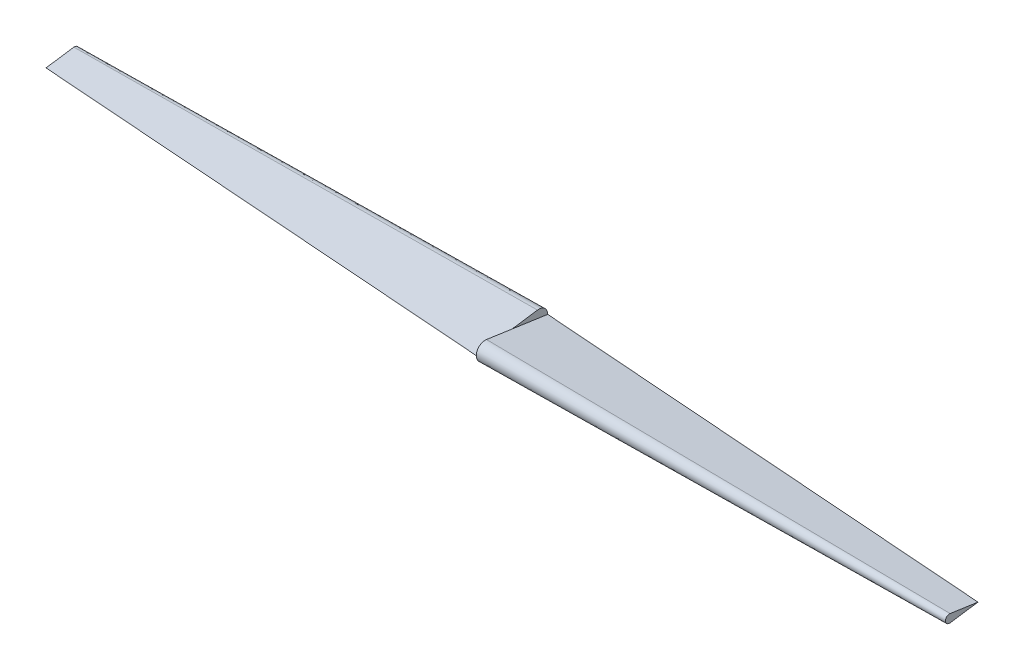
ISO-10303-21;
HEADER;
FILE_DESCRIPTION(('STEP AP214'),'2;1');
FILE_NAME('part.step','',(''),(''),'','','');
FILE_SCHEMA(('AUTOMOTIVE_DESIGN { 1 0 10303 214 1 1 1 1 }'));
ENDSEC;
DATA;
#1=APPLICATION_CONTEXT('core data for automotive mechanical design processes');
#2=APPLICATION_PROTOCOL_DEFINITION('international standard','automotive_design',2000,#1);
#3=PRODUCT_CONTEXT('',#1,'mechanical');
#4=PRODUCT('Part','Part','',(#3));
#5=PRODUCT_RELATED_PRODUCT_CATEGORY('part','',(#4));
#6=PRODUCT_DEFINITION_FORMATION('','',#4);
#7=PRODUCT_DEFINITION_CONTEXT('part definition',#1,'design');
#8=PRODUCT_DEFINITION('design','',#6,#7);
#9=PRODUCT_DEFINITION_SHAPE('','',#8);
#10=(LENGTH_UNIT() NAMED_UNIT(*) SI_UNIT(.MILLI.,.METRE.));
#11=(NAMED_UNIT(*) PLANE_ANGLE_UNIT() SI_UNIT($,.RADIAN.));
#12=(NAMED_UNIT(*) SI_UNIT($,.STERADIAN.) SOLID_ANGLE_UNIT());
#13=UNCERTAINTY_MEASURE_WITH_UNIT(LENGTH_MEASURE(1.E-05),#10,'distance_accuracy_value','');
#14=(GEOMETRIC_REPRESENTATION_CONTEXT(3) GLOBAL_UNCERTAINTY_ASSIGNED_CONTEXT((#13)) GLOBAL_UNIT_ASSIGNED_CONTEXT((#10,
#11,#12)) REPRESENTATION_CONTEXT('',''));
#15=CARTESIAN_POINT('',(0.,0.,0.));
#16=DIRECTION('',(0.,0.,1.));
#17=DIRECTION('',(1.,0.,0.));
#18=AXIS2_PLACEMENT_3D('',#15,#16,#17);
#19=CARTESIAN_POINT('',(0.,0.,38.1));
#20=DIRECTION('',(1.,0.,0.));
#21=DIRECTION('',(0.,0.,-1.));
#22=AXIS2_PLACEMENT_3D('',#19,#20,#21);
#23=PLANE('',#22);
#24=DIRECTION('',(0.,0.142857142857143,0.989743318610787));
#25=VECTOR('',#24,1.);
#26=CARTESIAN_POINT('',(0.,0.,50.8));
#27=LINE('',#26,#25);
#28=CARTESIAN_POINT('',(0.,-7.33234841870825,-2.25514051876985E-13));
#29=VERTEX_POINT('',#28);
#30=CARTESIAN_POINT('',(0.,0.,50.8));
#31=VERTEX_POINT('',#30);
#32=EDGE_CURVE('E11',#29,#31,#27,.T.);
#33=ORIENTED_EDGE('',*,*,#32,.F.);
#34=DIRECTION('',(0.,0.142857142857143,-0.989743318610787));
#35=VECTOR('',#34,1.);
#36=CARTESIAN_POINT('',(0.,0.,-50.8));
#37=LINE('',#36,#35);
#38=CARTESIAN_POINT('',(0.,-12.569740146357,36.2857142857143));
#39=VERTEX_POINT('',#38);
#40=EDGE_CURVE('E149',#39,#29,#37,.T.);
#41=ORIENTED_EDGE('',*,*,#40,.F.);
#42=CARTESIAN_POINT('',(0.,0.,38.1));
#43=DIRECTION('',(1.,0.,0.));
#44=DIRECTION('',(0.,0.,-1.));
#45=AXIS2_PLACEMENT_3D('',#42,#43,#44);
#46=CIRCLE('',#45,12.7);
#47=EDGE_CURVE('E155',#31,#39,#46,.T.);
#48=ORIENTED_EDGE('',*,*,#47,.F.);
#49=EDGE_LOOP('',(#33,#41,#48));
#50=FACE_BOUND('',#49,.T.);
#51=ADVANCED_FACE('F41',(#50),#23,.F.);
#52=DIRECTION('',(0.,0.142857142857143,-0.989743318610787));
#53=VECTOR('',#52,1.);
#54=CARTESIAN_POINT('',(0.,0.,50.8));
#55=LINE('',#54,#53);
#56=CARTESIAN_POINT('',(0.,7.33234841870828,-2.28983498828939E-13));
#57=VERTEX_POINT('',#56);
#58=EDGE_CURVE('E60',#31,#57,#55,.T.);
#59=ORIENTED_EDGE('',*,*,#58,.F.);
#60=CARTESIAN_POINT('',(0.,12.569740146357,36.2857142857143));
#61=VERTEX_POINT('',#60);
#62=EDGE_CURVE('E156',#61,#31,#46,.T.);
#63=ORIENTED_EDGE('',*,*,#62,.F.);
#64=DIRECTION('',(0.,0.142857142857143,0.989743318610787));
#65=VECTOR('',#64,1.);
#66=CARTESIAN_POINT('',(0.,0.,-50.8));
#67=LINE('',#66,#65);
#68=EDGE_CURVE('E152',#57,#61,#67,.T.);
#69=ORIENTED_EDGE('',*,*,#68,.F.);
#70=EDGE_LOOP('',(#59,#63,#69));
#71=FACE_BOUND('',#70,.T.);
#72=ADVANCED_FACE('F190',(#71),#23,.F.);
#73=CARTESIAN_POINT('',(0.,0.,-50.8));
#74=DIRECTION('',(0.0104717841162458,-0.989689050356648,-0.142849309909359));
#75=DIRECTION('',(0.,0.142857142857143,-0.989743318610787));
#76=AXIS2_PLACEMENT_3D('',#73,#74,#75);
#77=PLANE('',#76);
#78=ORIENTED_EDGE('',*,*,#40,.T.);
#79=CARTESIAN_POINT('',(0.,0.,-50.8));
#80=VERTEX_POINT('',#79);
#81=EDGE_CURVE('E141',#29,#80,#37,.T.);
#82=ORIENTED_EDGE('',*,*,#81,.T.);
#83=DIRECTION('',(-0.997323858980031,0.,-0.0731103297023057));
#84=VECTOR('',#83,1.);
#85=CARTESIAN_POINT('',(0.,0.,-50.8));
#86=LINE('',#85,#84);
#87=CARTESIAN_POINT('',(660.4,0.,-2.38838194768445));
#88=VERTEX_POINT('',#87);
#89=EDGE_CURVE('E51',#88,#80,#86,.T.);
#90=ORIENTED_EDGE('',*,*,#89,.F.);
#91=DIRECTION('',(0.,-0.142857142857143,0.989743318610787));
#92=VECTOR('',#91,1.);
#93=CARTESIAN_POINT('',(660.4,6.84501078720238,-49.8120077948507));
#94=LINE('',#93,#92);
#95=CARTESIAN_POINT('',(660.4,-5.72472935915461,37.2737064908636));
#96=VERTEX_POINT('',#95);
#97=EDGE_CURVE('E160',#96,#88,#94,.F.);
#98=ORIENTED_EDGE('',*,*,#97,.F.);
#99=DIRECTION('',(-0.999945169365512,-0.0103643783629889,-0.00149596915946369));
#100=VECTOR('',#99,1.);
#101=CARTESIAN_POINT('',(0.,-12.569740146357,36.2857142857143));
#102=LINE('',#101,#100);
#103=EDGE_CURVE('E165',#96,#39,#102,.T.);
#104=ORIENTED_EDGE('',*,*,#103,.T.);
#105=EDGE_LOOP('',(#78,#82,#90,#98,#104));
#106=FACE_BOUND('',#105,.T.);
#107=ADVANCED_FACE('F187',(#106),#77,.T.);
#108=CARTESIAN_POINT('',(0.,0.,-50.8));
#109=DIRECTION('',(0.0104717841162458,0.989689050356648,-0.142849309909359));
#110=DIRECTION('',(0.,0.142857142857143,0.989743318610787));
#111=AXIS2_PLACEMENT_3D('',#108,#109,#110);
#112=PLANE('',#111);
#113=EDGE_CURVE('E127',#80,#57,#67,.T.);
#114=ORIENTED_EDGE('',*,*,#113,.T.);
#115=ORIENTED_EDGE('',*,*,#68,.T.);
#116=DIRECTION('',(-0.999945169365512,0.0103643783629889,-0.00149596915946368));
#117=VECTOR('',#116,1.);
#118=CARTESIAN_POINT('',(0.,12.569740146357,36.2857142857143));
#119=LINE('',#118,#117);
#120=CARTESIAN_POINT('',(660.4,5.72472935915461,37.2737064908636));
#121=VERTEX_POINT('',#120);
#122=EDGE_CURVE('E164',#121,#61,#119,.T.);
#123=ORIENTED_EDGE('',*,*,#122,.F.);
#124=DIRECTION('',(0.,-0.142857142857143,-0.989743318610787));
#125=VECTOR('',#124,1.);
#126=CARTESIAN_POINT('',(660.4,-6.84501078720238,-49.8120077948507));
#127=LINE('',#126,#125);
#128=EDGE_CURVE('E174',#88,#121,#127,.F.);
#129=ORIENTED_EDGE('',*,*,#128,.F.);
#130=ORIENTED_EDGE('',*,*,#89,.T.);
#131=EDGE_LOOP('',(#114,#115,#123,#129,#130));
#132=FACE_BOUND('',#131,.T.);
#133=ADVANCED_FACE('F43',(#132),#112,.T.);
#134=CARTESIAN_POINT('',(0.,0.,38.1));
#135=DIRECTION('',(-1.,0.,0.));
#136=DIRECTION('',(0.,0.,-1.));
#137=AXIS2_PLACEMENT_3D('',#134,#135,#136);
#138=CONICAL_SURFACE('',#137,12.7,0.010471975511966);
#139=ORIENTED_EDGE('',*,*,#62,.T.);
#140=ORIENTED_EDGE('',*,*,#47,.T.);
#141=ORIENTED_EDGE('',*,*,#103,.F.);
#142=CARTESIAN_POINT('',(660.4,0.,38.1));
#143=DIRECTION('',(1.,0.,0.));
#144=DIRECTION('',(0.,0.,-1.));
#145=AXIS2_PLACEMENT_3D('',#142,#143,#144);
#146=CIRCLE('',#145,5.78405456395492);
#147=EDGE_CURVE('E45',#121,#96,#146,.T.);
#148=ORIENTED_EDGE('',*,*,#147,.F.);
#149=ORIENTED_EDGE('',*,*,#122,.T.);
#150=EDGE_LOOP('',(#139,#140,#141,#148,#149));
#151=FACE_BOUND('',#150,.T.);
#152=ADVANCED_FACE('F185',(#151),#138,.T.);
#153=CARTESIAN_POINT('',(660.4,0.,38.1));
#154=DIRECTION('',(1.,0.,0.));
#155=DIRECTION('',(0.,0.,-1.));
#156=AXIS2_PLACEMENT_3D('',#153,#154,#155);
#157=PLANE('',#156);
#158=ORIENTED_EDGE('',*,*,#97,.T.);
#159=ORIENTED_EDGE('',*,*,#128,.T.);
#160=ORIENTED_EDGE('',*,*,#147,.T.);
#161=EDGE_LOOP('',(#158,#159,#160));
#162=FACE_BOUND('',#161,.T.);
#163=ADVANCED_FACE('F181',(#162),#157,.T.);
#164=CARTESIAN_POINT('',(0.,0.,-38.1));
#165=DIRECTION('',(-1.,0.,0.));
#166=DIRECTION('',(0.,0.,1.));
#167=AXIS2_PLACEMENT_3D('',#164,#165,#166);
#168=PLANE('',#167);
#169=ORIENTED_EDGE('',*,*,#81,.F.);
#170=CARTESIAN_POINT('',(0.,-12.569740146357,-36.2857142857143));
#171=VERTEX_POINT('',#170);
#172=EDGE_CURVE('E53',#171,#29,#27,.T.);
#173=ORIENTED_EDGE('',*,*,#172,.F.);
#174=CARTESIAN_POINT('',(0.,0.,-38.1));
#175=DIRECTION('',(-1.,0.,0.));
#176=DIRECTION('',(0.,0.,1.));
#177=AXIS2_PLACEMENT_3D('',#174,#175,#176);
#178=CIRCLE('',#177,12.7);
#179=EDGE_CURVE('E131',#80,#171,#178,.T.);
#180=ORIENTED_EDGE('',*,*,#179,.F.);
#181=EDGE_LOOP('',(#169,#173,#180));
#182=FACE_BOUND('',#181,.T.);
#183=ADVANCED_FACE('F208',(#182),#168,.F.);
#184=CARTESIAN_POINT('',(0.,0.,50.8));
#185=DIRECTION('',(-0.0104717841162458,-0.989689050356648,0.142849309909359));
#186=DIRECTION('',(0.,-0.142857142857143,-0.989743318610787));
#187=AXIS2_PLACEMENT_3D('',#184,#185,#186);
#188=PLANE('',#187);
#189=ORIENTED_EDGE('',*,*,#172,.T.);
#190=ORIENTED_EDGE('',*,*,#32,.T.);
#191=DIRECTION('',(0.997323858980031,0.,0.0731103297023057));
#192=VECTOR('',#191,1.);
#193=CARTESIAN_POINT('',(0.,0.,50.8));
#194=LINE('',#193,#192);
#195=CARTESIAN_POINT('',(-660.4,0.,2.38838194768445));
#196=VERTEX_POINT('',#195);
#197=EDGE_CURVE('E123',#196,#31,#194,.T.);
#198=ORIENTED_EDGE('',*,*,#197,.F.);
#199=DIRECTION('',(0.,-0.142857142857143,-0.989743318610787));
#200=VECTOR('',#199,1.);
#201=CARTESIAN_POINT('',(-660.4,6.84501078720238,49.8120077948507));
#202=LINE('',#201,#200);
#203=CARTESIAN_POINT('',(-660.4,-5.72472935915461,-37.2737064908636));
#204=VERTEX_POINT('',#203);
#205=EDGE_CURVE('E130',#204,#196,#202,.F.);
#206=ORIENTED_EDGE('',*,*,#205,.F.);
#207=DIRECTION('',(0.999945169365512,-0.0103643783629889,0.00149596915946369));
#208=VECTOR('',#207,1.);
#209=CARTESIAN_POINT('',(0.,-12.569740146357,-36.2857142857143));
#210=LINE('',#209,#208);
#211=EDGE_CURVE('E124',#204,#171,#210,.T.);
#212=ORIENTED_EDGE('',*,*,#211,.T.);
#213=EDGE_LOOP('',(#189,#190,#198,#206,#212));
#214=FACE_BOUND('',#213,.T.);
#215=ADVANCED_FACE('F241',(#214),#188,.T.);
#216=CARTESIAN_POINT('',(0.,0.,50.8));
#217=DIRECTION('',(-0.0104717841162458,0.989689050356648,0.142849309909359));
#218=DIRECTION('',(0.,-0.142857142857143,0.989743318610787));
#219=AXIS2_PLACEMENT_3D('',#216,#217,#218);
#220=PLANE('',#219);
#221=ORIENTED_EDGE('',*,*,#58,.T.);
#222=CARTESIAN_POINT('',(0.,12.569740146357,-36.2857142857143));
#223=VERTEX_POINT('',#222);
#224=EDGE_CURVE('E105',#57,#223,#55,.T.);
#225=ORIENTED_EDGE('',*,*,#224,.T.);
#226=DIRECTION('',(0.999945169365512,0.0103643783629889,0.00149596915946368));
#227=VECTOR('',#226,1.);
#228=CARTESIAN_POINT('',(0.,12.569740146357,-36.2857142857143));
#229=LINE('',#228,#227);
#230=CARTESIAN_POINT('',(-660.4,5.72472935915461,-37.2737064908636));
#231=VERTEX_POINT('',#230);
#232=EDGE_CURVE('E108',#231,#223,#229,.T.);
#233=ORIENTED_EDGE('',*,*,#232,.F.);
#234=DIRECTION('',(0.,-0.142857142857143,0.989743318610787));
#235=VECTOR('',#234,1.);
#236=CARTESIAN_POINT('',(-660.4,-6.84501078720238,49.8120077948507));
#237=LINE('',#236,#235);
#238=EDGE_CURVE('E136',#196,#231,#237,.F.);
#239=ORIENTED_EDGE('',*,*,#238,.F.);
#240=ORIENTED_EDGE('',*,*,#197,.T.);
#241=EDGE_LOOP('',(#221,#225,#233,#239,#240));
#242=FACE_BOUND('',#241,.T.);
#243=ADVANCED_FACE('F107',(#242),#220,.T.);
#244=CARTESIAN_POINT('',(0.,0.,-38.1));
#245=DIRECTION('',(1.,0.,0.));
#246=DIRECTION('',(0.,0.,1.));
#247=AXIS2_PLACEMENT_3D('',#244,#245,#246);
#248=CONICAL_SURFACE('',#247,12.7,0.010471975511966);
#249=EDGE_CURVE('E119',#223,#80,#178,.T.);
#250=ORIENTED_EDGE('',*,*,#249,.T.);
#251=ORIENTED_EDGE('',*,*,#179,.T.);
#252=ORIENTED_EDGE('',*,*,#211,.F.);
#253=CARTESIAN_POINT('',(-660.4,0.,-38.1));
#254=DIRECTION('',(-1.,0.,0.));
#255=DIRECTION('',(0.,0.,1.));
#256=AXIS2_PLACEMENT_3D('',#253,#254,#255);
#257=CIRCLE('',#256,5.78405456395492);
#258=EDGE_CURVE('E121',#231,#204,#257,.T.);
#259=ORIENTED_EDGE('',*,*,#258,.F.);
#260=ORIENTED_EDGE('',*,*,#232,.T.);
#261=EDGE_LOOP('',(#250,#251,#252,#259,#260));
#262=FACE_BOUND('',#261,.T.);
#263=ADVANCED_FACE('F118',(#262),#248,.T.);
#264=CARTESIAN_POINT('',(-660.4,0.,-38.1));
#265=DIRECTION('',(-1.,0.,0.));
#266=DIRECTION('',(0.,0.,1.));
#267=AXIS2_PLACEMENT_3D('',#264,#265,#266);
#268=PLANE('',#267);
#269=ORIENTED_EDGE('',*,*,#205,.T.);
#270=ORIENTED_EDGE('',*,*,#238,.T.);
#271=ORIENTED_EDGE('',*,*,#258,.T.);
#272=EDGE_LOOP('',(#269,#270,#271));
#273=FACE_BOUND('',#272,.T.);
#274=ADVANCED_FACE('F260',(#273),#268,.T.);
#275=ORIENTED_EDGE('',*,*,#113,.F.);
#276=ORIENTED_EDGE('',*,*,#249,.F.);
#277=ORIENTED_EDGE('',*,*,#224,.F.);
#278=EDGE_LOOP('',(#275,#276,#277));
#279=FACE_BOUND('',#278,.T.);
#280=ADVANCED_FACE('F126',(#279),#168,.F.);
#281=CLOSED_SHELL('',(#51,#72,#107,#133,#152,#163,#183,#215,#243,#263,#274,#280));
#282=MANIFOLD_SOLID_BREP('B2',#281);
#283=ADVANCED_BREP_SHAPE_REPRESENTATION('',(#18,#282),#14);
#284=SHAPE_DEFINITION_REPRESENTATION(#9,#283);
ENDSEC;
END-ISO-10303-21;
